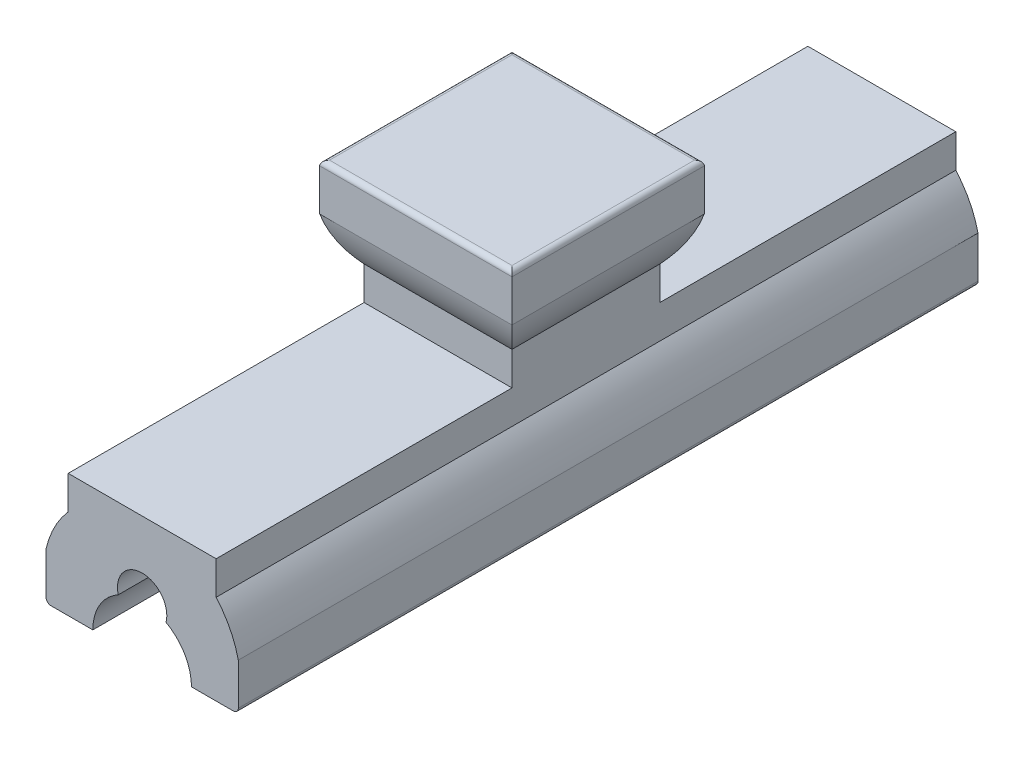
ISO-10303-21;
HEADER;
FILE_DESCRIPTION(('STEP AP214'),'2;1');
FILE_NAME('part.step','',(''),(''),'','','');
FILE_SCHEMA(('AUTOMOTIVE_DESIGN { 1 0 10303 214 1 1 1 1 }'));
ENDSEC;
DATA;
#1=APPLICATION_CONTEXT('core data for automotive mechanical design processes');
#2=APPLICATION_PROTOCOL_DEFINITION('international standard','automotive_design',2000,#1);
#3=PRODUCT_CONTEXT('',#1,'mechanical');
#4=PRODUCT('Part','Part','',(#3));
#5=PRODUCT_RELATED_PRODUCT_CATEGORY('part','',(#4));
#6=PRODUCT_DEFINITION_FORMATION('','',#4);
#7=PRODUCT_DEFINITION_CONTEXT('part definition',#1,'design');
#8=PRODUCT_DEFINITION('design','',#6,#7);
#9=PRODUCT_DEFINITION_SHAPE('','',#8);
#10=(LENGTH_UNIT() NAMED_UNIT(*) SI_UNIT(.MILLI.,.METRE.));
#11=(NAMED_UNIT(*) PLANE_ANGLE_UNIT() SI_UNIT($,.RADIAN.));
#12=(NAMED_UNIT(*) SI_UNIT($,.STERADIAN.) SOLID_ANGLE_UNIT());
#13=UNCERTAINTY_MEASURE_WITH_UNIT(LENGTH_MEASURE(1.E-05),#10,'distance_accuracy_value','');
#14=(GEOMETRIC_REPRESENTATION_CONTEXT(3) GLOBAL_UNCERTAINTY_ASSIGNED_CONTEXT((#13)) GLOBAL_UNIT_ASSIGNED_CONTEXT((#10,
#11,#12)) REPRESENTATION_CONTEXT('',''));
#15=CARTESIAN_POINT('',(0.,0.,0.));
#16=DIRECTION('',(0.,0.,1.));
#17=DIRECTION('',(1.,0.,0.));
#18=AXIS2_PLACEMENT_3D('',#15,#16,#17);
#19=CARTESIAN_POINT('',(0.,2.,-2.));
#20=DIRECTION('',(0.,0.,1.));
#21=DIRECTION('',(1.,0.,0.));
#22=AXIS2_PLACEMENT_3D('',#19,#20,#21);
#23=CYLINDRICAL_SURFACE('',#22,2.);
#24=DIRECTION('',(0.,0.,1.));
#25=VECTOR('',#24,1.);
#26=CARTESIAN_POINT('',(-1.5,0.677124344467706,-2.));
#27=LINE('',#26,#25);
#28=CARTESIAN_POINT('',(-1.5,0.677124344467706,-1.5));
#29=VERTEX_POINT('',#28);
#30=CARTESIAN_POINT('',(-1.5,0.677124344467706,1.5));
#31=VERTEX_POINT('',#30);
#32=EDGE_CURVE('E228',#29,#31,#27,.T.);
#33=ORIENTED_EDGE('',*,*,#32,.T.);
#34=CARTESIAN_POINT('',(0.,2.,0.));
#35=DIRECTION('',(0.707106781186547,0.,0.707106781186547));
#36=DIRECTION('',(0.707106781186547,0.,-0.707106781186547));
#37=AXIS2_PLACEMENT_3D('',#34,#35,#36);
#38=ELLIPSE('',#37,2.82842712474619,2.);
#39=CARTESIAN_POINT('',(-1.95,1.55559027913422,1.95));
#40=VERTEX_POINT('',#39);
#41=EDGE_CURVE('E203',#31,#40,#38,.F.);
#42=ORIENTED_EDGE('',*,*,#41,.T.);
#43=DIRECTION('',(0.,0.,1.));
#44=VECTOR('',#43,1.);
#45=CARTESIAN_POINT('',(-1.95,1.55559027913422,-2.));
#46=LINE('',#45,#44);
#47=CARTESIAN_POINT('',(-1.95,1.55559027913422,-1.95));
#48=VERTEX_POINT('',#47);
#49=EDGE_CURVE('E226',#48,#40,#46,.T.);
#50=ORIENTED_EDGE('',*,*,#49,.F.);
#51=CARTESIAN_POINT('',(0.,2.,0.));
#52=DIRECTION('',(0.707106781186547,0.,-0.707106781186547));
#53=DIRECTION('',(0.707106781186547,0.,0.707106781186547));
#54=AXIS2_PLACEMENT_3D('',#51,#52,#53);
#55=ELLIPSE('',#54,2.82842712474619,2.);
#56=EDGE_CURVE('E332',#48,#29,#55,.F.);
#57=ORIENTED_EDGE('',*,*,#56,.T.);
#58=EDGE_LOOP('',(#33,#42,#50,#57));
#59=FACE_BOUND('',#58,.T.);
#60=ADVANCED_FACE('F36',(#59),#23,.T.);
#61=CARTESIAN_POINT('',(-1.95,-1.90134985467839,-2.));
#62=DIRECTION('',(-1.,0.,0.));
#63=DIRECTION('',(0.,0.,1.));
#64=AXIS2_PLACEMENT_3D('',#61,#62,#63);
#65=PLANE('',#64);
#66=DIRECTION('',(0.,1.,0.));
#67=VECTOR('',#66,1.);
#68=CARTESIAN_POINT('',(-1.95,2.5,1.95));
#69=LINE('',#68,#67);
#70=CARTESIAN_POINT('',(-1.95,2.4,1.95));
#71=VERTEX_POINT('',#70);
#72=EDGE_CURVE('E214',#40,#71,#69,.T.);
#73=ORIENTED_EDGE('',*,*,#72,.T.);
#74=DIRECTION('',(0.,0.,1.));
#75=VECTOR('',#74,1.);
#76=CARTESIAN_POINT('',(-1.95,2.4,-1.95));
#77=LINE('',#76,#75);
#78=CARTESIAN_POINT('',(-1.95,2.4,-1.95));
#79=VERTEX_POINT('',#78);
#80=EDGE_CURVE('E282',#71,#79,#77,.F.);
#81=ORIENTED_EDGE('',*,*,#80,.T.);
#82=DIRECTION('',(0.,-1.,0.));
#83=VECTOR('',#82,1.);
#84=CARTESIAN_POINT('',(-1.95,2.5,-1.95));
#85=LINE('',#84,#83);
#86=EDGE_CURVE('E210',#79,#48,#85,.T.);
#87=ORIENTED_EDGE('',*,*,#86,.T.);
#88=ORIENTED_EDGE('',*,*,#49,.T.);
#89=EDGE_LOOP('',(#73,#81,#87,#88));
#90=FACE_BOUND('',#89,.T.);
#91=ADVANCED_FACE('F231',(#90),#65,.T.);
#92=CARTESIAN_POINT('',(0.,2.5,-2.));
#93=DIRECTION('',(0.,-1.,0.));
#94=DIRECTION('',(0.,0.,-1.));
#95=AXIS2_PLACEMENT_3D('',#92,#93,#94);
#96=PLANE('',#95);
#97=DIRECTION('',(-1.,0.,0.));
#98=VECTOR('',#97,1.);
#99=CARTESIAN_POINT('',(-1.95,2.5,-1.85));
#100=LINE('',#99,#98);
#101=CARTESIAN_POINT('',(1.85,2.5,-1.85));
#102=VERTEX_POINT('',#101);
#103=CARTESIAN_POINT('',(-1.85,2.5,-1.85));
#104=VERTEX_POINT('',#103);
#105=EDGE_CURVE('E277',#102,#104,#100,.T.);
#106=ORIENTED_EDGE('',*,*,#105,.T.);
#107=DIRECTION('',(0.,0.,1.));
#108=VECTOR('',#107,1.);
#109=CARTESIAN_POINT('',(-1.85,2.5,1.95));
#110=LINE('',#109,#108);
#111=CARTESIAN_POINT('',(-1.85,2.5,1.85));
#112=VERTEX_POINT('',#111);
#113=EDGE_CURVE('E279',#104,#112,#110,.T.);
#114=ORIENTED_EDGE('',*,*,#113,.T.);
#115=DIRECTION('',(-1.,0.,0.));
#116=VECTOR('',#115,1.);
#117=CARTESIAN_POINT('',(1.95,2.5,1.85));
#118=LINE('',#117,#116);
#119=CARTESIAN_POINT('',(1.85,2.5,1.85));
#120=VERTEX_POINT('',#119);
#121=EDGE_CURVE('E273',#112,#120,#118,.F.);
#122=ORIENTED_EDGE('',*,*,#121,.T.);
#123=DIRECTION('',(0.,0.,1.));
#124=VECTOR('',#123,1.);
#125=CARTESIAN_POINT('',(1.85,2.5,-2.));
#126=LINE('',#125,#124);
#127=EDGE_CURVE('E275',#120,#102,#126,.F.);
#128=ORIENTED_EDGE('',*,*,#127,.T.);
#129=EDGE_LOOP('',(#106,#114,#122,#128));
#130=FACE_BOUND('',#129,.T.);
#131=ADVANCED_FACE('F530',(#130),#96,.F.);
#132=CARTESIAN_POINT('',(1.95,-1.90134985467839,-2.));
#133=DIRECTION('',(-1.,0.,0.));
#134=DIRECTION('',(0.,0.,1.));
#135=AXIS2_PLACEMENT_3D('',#132,#133,#134);
#136=PLANE('',#135);
#137=DIRECTION('',(0.,1.,0.));
#138=VECTOR('',#137,1.);
#139=CARTESIAN_POINT('',(1.95,2.5,-1.95));
#140=LINE('',#139,#138);
#141=CARTESIAN_POINT('',(1.95,1.55559027913422,-1.95));
#142=VERTEX_POINT('',#141);
#143=CARTESIAN_POINT('',(1.95,2.4,-1.95));
#144=VERTEX_POINT('',#143);
#145=EDGE_CURVE('E327',#142,#144,#140,.T.);
#146=ORIENTED_EDGE('',*,*,#145,.T.);
#147=DIRECTION('',(0.,0.,1.));
#148=VECTOR('',#147,1.);
#149=CARTESIAN_POINT('',(1.95,2.4,-2.));
#150=LINE('',#149,#148);
#151=CARTESIAN_POINT('',(1.95,2.4,1.95));
#152=VERTEX_POINT('',#151);
#153=EDGE_CURVE('E286',#144,#152,#150,.T.);
#154=ORIENTED_EDGE('',*,*,#153,.T.);
#155=DIRECTION('',(0.,-1.,0.));
#156=VECTOR('',#155,1.);
#157=CARTESIAN_POINT('',(1.95,2.5,1.95));
#158=LINE('',#157,#156);
#159=CARTESIAN_POINT('',(1.95,1.55559027913422,1.95));
#160=VERTEX_POINT('',#159);
#161=EDGE_CURVE('E211',#152,#160,#158,.T.);
#162=ORIENTED_EDGE('',*,*,#161,.T.);
#163=DIRECTION('',(0.,0.,1.));
#164=VECTOR('',#163,1.);
#165=CARTESIAN_POINT('',(1.95,1.55559027913422,-2.));
#166=LINE('',#165,#164);
#167=EDGE_CURVE('E234',#142,#160,#166,.T.);
#168=ORIENTED_EDGE('',*,*,#167,.F.);
#169=EDGE_LOOP('',(#146,#154,#162,#168));
#170=FACE_BOUND('',#169,.T.);
#171=ADVANCED_FACE('F324',(#170),#136,.F.);
#172=CARTESIAN_POINT('',(0.,2.,-2.));
#173=DIRECTION('',(0.,0.,1.));
#174=DIRECTION('',(1.,0.,0.));
#175=AXIS2_PLACEMENT_3D('',#172,#173,#174);
#176=CYLINDRICAL_SURFACE('',#175,2.);
#177=ORIENTED_EDGE('',*,*,#167,.T.);
#178=CARTESIAN_POINT('',(0.,2.,0.));
#179=DIRECTION('',(-0.707106781186547,0.,0.707106781186547));
#180=DIRECTION('',(-0.707106781186547,0.,-0.707106781186547));
#181=AXIS2_PLACEMENT_3D('',#178,#179,#180);
#182=ELLIPSE('',#181,2.82842712474619,2.);
#183=CARTESIAN_POINT('',(1.5,0.677124344467706,1.5));
#184=VERTEX_POINT('',#183);
#185=EDGE_CURVE('E206',#184,#160,#182,.T.);
#186=ORIENTED_EDGE('',*,*,#185,.F.);
#187=DIRECTION('',(0.,0.,1.));
#188=VECTOR('',#187,1.);
#189=CARTESIAN_POINT('',(1.5,0.677124344467706,-2.));
#190=LINE('',#189,#188);
#191=CARTESIAN_POINT('',(1.5,0.677124344467706,-1.5));
#192=VERTEX_POINT('',#191);
#193=EDGE_CURVE('E238',#192,#184,#190,.T.);
#194=ORIENTED_EDGE('',*,*,#193,.F.);
#195=CARTESIAN_POINT('',(0.,2.,0.));
#196=DIRECTION('',(-0.707106781186547,0.,-0.707106781186547));
#197=DIRECTION('',(-0.707106781186547,0.,0.707106781186547));
#198=AXIS2_PLACEMENT_3D('',#195,#196,#197);
#199=ELLIPSE('',#198,2.82842712474619,2.);
#200=EDGE_CURVE('E335',#142,#192,#199,.T.);
#201=ORIENTED_EDGE('',*,*,#200,.F.);
#202=EDGE_LOOP('',(#177,#186,#194,#201));
#203=FACE_BOUND('',#202,.T.);
#204=ADVANCED_FACE('F474',(#203),#176,.T.);
#205=CARTESIAN_POINT('',(-1.5,0.,-7.5));
#206=DIRECTION('',(0.,1.,0.));
#207=DIRECTION('',(0.,0.,1.));
#208=AXIS2_PLACEMENT_3D('',#205,#206,#207);
#209=PLANE('',#208);
#210=DIRECTION('',(-1.,0.,0.));
#211=VECTOR('',#210,1.);
#212=CARTESIAN_POINT('',(-1.5,0.,-1.5));
#213=LINE('',#212,#211);
#214=CARTESIAN_POINT('',(1.5,0.,-1.5));
#215=VERTEX_POINT('',#214);
#216=CARTESIAN_POINT('',(-1.5,0.,-1.5));
#217=VERTEX_POINT('',#216);
#218=EDGE_CURVE('E255',#215,#217,#213,.T.);
#219=ORIENTED_EDGE('',*,*,#218,.F.);
#220=DIRECTION('',(0.,0.,1.));
#221=VECTOR('',#220,1.);
#222=CARTESIAN_POINT('',(1.5,0.,-7.5));
#223=LINE('',#222,#221);
#224=CARTESIAN_POINT('',(1.5,0.,-7.5));
#225=VERTEX_POINT('',#224);
#226=EDGE_CURVE('E365',#225,#215,#223,.T.);
#227=ORIENTED_EDGE('',*,*,#226,.F.);
#228=DIRECTION('',(-1.,0.,0.));
#229=VECTOR('',#228,1.);
#230=CARTESIAN_POINT('',(-1.5,0.,-7.5));
#231=LINE('',#230,#229);
#232=CARTESIAN_POINT('',(-1.5,0.,-7.5));
#233=VERTEX_POINT('',#232);
#234=EDGE_CURVE('E398',#225,#233,#231,.T.);
#235=ORIENTED_EDGE('',*,*,#234,.T.);
#236=DIRECTION('',(0.,0.,1.));
#237=VECTOR('',#236,1.);
#238=CARTESIAN_POINT('',(-1.5,0.,-7.5));
#239=LINE('',#238,#237);
#240=EDGE_CURVE('E367',#233,#217,#239,.T.);
#241=ORIENTED_EDGE('',*,*,#240,.T.);
#242=EDGE_LOOP('',(#219,#227,#235,#241));
#243=FACE_BOUND('',#242,.T.);
#244=ADVANCED_FACE('F363',(#243),#209,.T.);
#245=CARTESIAN_POINT('',(-1.5,0.,-7.5));
#246=DIRECTION('',(-1.,0.,0.));
#247=DIRECTION('',(0.,0.,1.));
#248=AXIS2_PLACEMENT_3D('',#245,#246,#247);
#249=PLANE('',#248);
#250=ORIENTED_EDGE('',*,*,#32,.F.);
#251=DIRECTION('',(0.,-1.,0.));
#252=VECTOR('',#251,1.);
#253=CARTESIAN_POINT('',(-1.5,1.,-1.5));
#254=LINE('',#253,#252);
#255=EDGE_CURVE('E347',#29,#217,#254,.T.);
#256=ORIENTED_EDGE('',*,*,#255,.T.);
#257=ORIENTED_EDGE('',*,*,#240,.F.);
#258=DIRECTION('',(0.,-1.,0.));
#259=VECTOR('',#258,1.);
#260=CARTESIAN_POINT('',(-1.5,0.,-7.5));
#261=LINE('',#260,#259);
#262=CARTESIAN_POINT('',(-1.5,-0.677124344467706,-7.5));
#263=VERTEX_POINT('',#262);
#264=EDGE_CURVE('E428',#233,#263,#261,.T.);
#265=ORIENTED_EDGE('',*,*,#264,.T.);
#266=DIRECTION('',(0.,0.,1.));
#267=VECTOR('',#266,1.);
#268=CARTESIAN_POINT('',(-1.5,-0.677124344467706,-7.5));
#269=LINE('',#268,#267);
#270=CARTESIAN_POINT('',(-1.5,-0.677124344467706,7.5));
#271=VERTEX_POINT('',#270);
#272=EDGE_CURVE('E397',#263,#271,#269,.T.);
#273=ORIENTED_EDGE('',*,*,#272,.T.);
#274=DIRECTION('',(0.,-1.,0.));
#275=VECTOR('',#274,1.);
#276=CARTESIAN_POINT('',(-1.5,0.,7.5));
#277=LINE('',#276,#275);
#278=CARTESIAN_POINT('',(-1.5,0.,7.5));
#279=VERTEX_POINT('',#278);
#280=EDGE_CURVE('E272',#279,#271,#277,.T.);
#281=ORIENTED_EDGE('',*,*,#280,.F.);
#282=CARTESIAN_POINT('',(-1.5,0.,1.5));
#283=VERTEX_POINT('',#282);
#284=EDGE_CURVE('E372',#283,#279,#239,.T.);
#285=ORIENTED_EDGE('',*,*,#284,.F.);
#286=DIRECTION('',(0.,-1.,0.));
#287=VECTOR('',#286,1.);
#288=CARTESIAN_POINT('',(-1.5,1.,1.5));
#289=LINE('',#288,#287);
#290=EDGE_CURVE('E267',#31,#283,#289,.T.);
#291=ORIENTED_EDGE('',*,*,#290,.F.);
#292=EDGE_LOOP('',(#250,#256,#257,#265,#273,#281,#285,#291));
#293=FACE_BOUND('',#292,.T.);
#294=ADVANCED_FACE('F346',(#293),#249,.T.);
#295=DIRECTION('',(1.,0.,0.));
#296=VECTOR('',#295,1.);
#297=CARTESIAN_POINT('',(-1.5,0.,1.5));
#298=LINE('',#297,#296);
#299=CARTESIAN_POINT('',(1.5,0.,1.5));
#300=VERTEX_POINT('',#299);
#301=EDGE_CURVE('E246',#283,#300,#298,.T.);
#302=ORIENTED_EDGE('',*,*,#301,.F.);
#303=ORIENTED_EDGE('',*,*,#284,.T.);
#304=DIRECTION('',(-1.,0.,0.));
#305=VECTOR('',#304,1.);
#306=CARTESIAN_POINT('',(-1.5,0.,7.5));
#307=LINE('',#306,#305);
#308=CARTESIAN_POINT('',(1.5,0.,7.5));
#309=VERTEX_POINT('',#308);
#310=EDGE_CURVE('E430',#309,#279,#307,.T.);
#311=ORIENTED_EDGE('',*,*,#310,.F.);
#312=EDGE_CURVE('E256',#300,#309,#223,.T.);
#313=ORIENTED_EDGE('',*,*,#312,.F.);
#314=EDGE_LOOP('',(#302,#303,#311,#313));
#315=FACE_BOUND('',#314,.T.);
#316=ADVANCED_FACE('F467',(#315),#209,.T.);
#317=CARTESIAN_POINT('',(1.5,0.,-7.5));
#318=DIRECTION('',(1.,0.,0.));
#319=DIRECTION('',(0.,0.,-1.));
#320=AXIS2_PLACEMENT_3D('',#317,#318,#319);
#321=PLANE('',#320);
#322=ORIENTED_EDGE('',*,*,#193,.T.);
#323=DIRECTION('',(0.,-1.,0.));
#324=VECTOR('',#323,1.);
#325=CARTESIAN_POINT('',(1.5,1.,1.5));
#326=LINE('',#325,#324);
#327=EDGE_CURVE('E264',#184,#300,#326,.T.);
#328=ORIENTED_EDGE('',*,*,#327,.T.);
#329=ORIENTED_EDGE('',*,*,#312,.T.);
#330=DIRECTION('',(0.,1.,0.));
#331=VECTOR('',#330,1.);
#332=CARTESIAN_POINT('',(1.5,0.,7.5));
#333=LINE('',#332,#331);
#334=CARTESIAN_POINT('',(1.5,-0.677124344467706,7.5));
#335=VERTEX_POINT('',#334);
#336=EDGE_CURVE('E433',#335,#309,#333,.T.);
#337=ORIENTED_EDGE('',*,*,#336,.F.);
#338=DIRECTION('',(0.,0.,1.));
#339=VECTOR('',#338,1.);
#340=CARTESIAN_POINT('',(1.5,-0.677124344467706,-7.5));
#341=LINE('',#340,#339);
#342=CARTESIAN_POINT('',(1.5,-0.677124344467706,-7.5));
#343=VERTEX_POINT('',#342);
#344=EDGE_CURVE('E374',#343,#335,#341,.T.);
#345=ORIENTED_EDGE('',*,*,#344,.F.);
#346=DIRECTION('',(0.,1.,0.));
#347=VECTOR('',#346,1.);
#348=CARTESIAN_POINT('',(1.5,0.,-7.5));
#349=LINE('',#348,#347);
#350=EDGE_CURVE('E370',#343,#225,#349,.T.);
#351=ORIENTED_EDGE('',*,*,#350,.T.);
#352=ORIENTED_EDGE('',*,*,#226,.T.);
#353=DIRECTION('',(0.,-1.,0.));
#354=VECTOR('',#353,1.);
#355=CARTESIAN_POINT('',(1.5,1.,-1.5));
#356=LINE('',#355,#354);
#357=EDGE_CURVE('E268',#192,#215,#356,.T.);
#358=ORIENTED_EDGE('',*,*,#357,.F.);
#359=EDGE_LOOP('',(#322,#328,#329,#337,#345,#351,#352,#358));
#360=FACE_BOUND('',#359,.T.);
#361=ADVANCED_FACE('F368',(#360),#321,.T.);
#362=CARTESIAN_POINT('',(0.,-2.,-7.5));
#363=DIRECTION('',(0.,0.,1.));
#364=DIRECTION('',(1.,0.,0.));
#365=AXIS2_PLACEMENT_3D('',#362,#363,#364);
#366=CYLINDRICAL_SURFACE('',#365,2.);
#367=ORIENTED_EDGE('',*,*,#344,.T.);
#368=CARTESIAN_POINT('',(0.,-2.,7.5));
#369=DIRECTION('',(0.,0.,1.));
#370=DIRECTION('',(1.,0.,0.));
#371=AXIS2_PLACEMENT_3D('',#368,#369,#370);
#372=CIRCLE('',#371,2.);
#373=CARTESIAN_POINT('',(1.95,-1.55559027913422,7.5));
#374=VERTEX_POINT('',#373);
#375=EDGE_CURVE('E436',#374,#335,#372,.T.);
#376=ORIENTED_EDGE('',*,*,#375,.F.);
#377=DIRECTION('',(0.,0.,1.));
#378=VECTOR('',#377,1.);
#379=CARTESIAN_POINT('',(1.95,-1.55559027913422,-7.5));
#380=LINE('',#379,#378);
#381=CARTESIAN_POINT('',(1.95,-1.55559027913422,-7.5));
#382=VERTEX_POINT('',#381);
#383=EDGE_CURVE('E383',#382,#374,#380,.T.);
#384=ORIENTED_EDGE('',*,*,#383,.F.);
#385=CARTESIAN_POINT('',(0.,-2.,-7.5));
#386=DIRECTION('',(0.,0.,1.));
#387=DIRECTION('',(1.,0.,0.));
#388=AXIS2_PLACEMENT_3D('',#385,#386,#387);
#389=CIRCLE('',#388,2.);
#390=EDGE_CURVE('E402',#382,#343,#389,.T.);
#391=ORIENTED_EDGE('',*,*,#390,.T.);
#392=EDGE_LOOP('',(#367,#376,#384,#391));
#393=FACE_BOUND('',#392,.T.);
#394=ADVANCED_FACE('F479',(#393),#366,.T.);
#395=CARTESIAN_POINT('',(1.95,-2.5,-7.5));
#396=DIRECTION('',(1.,0.,0.));
#397=DIRECTION('',(0.,1.,0.));
#398=AXIS2_PLACEMENT_3D('',#395,#396,#397);
#399=PLANE('',#398);
#400=DIRECTION('',(0.,1.,0.));
#401=VECTOR('',#400,1.);
#402=CARTESIAN_POINT('',(1.95,-2.5,7.5));
#403=LINE('',#402,#401);
#404=CARTESIAN_POINT('',(1.95,-2.4,7.5));
#405=VERTEX_POINT('',#404);
#406=EDGE_CURVE('E439',#405,#374,#403,.T.);
#407=ORIENTED_EDGE('',*,*,#406,.F.);
#408=DIRECTION('',(0.,0.,1.));
#409=VECTOR('',#408,1.);
#410=CARTESIAN_POINT('',(1.95,-2.4,-7.5));
#411=LINE('',#410,#409);
#412=CARTESIAN_POINT('',(1.95,-2.4,-7.5));
#413=VERTEX_POINT('',#412);
#414=EDGE_CURVE('E11',#405,#413,#411,.F.);
#415=ORIENTED_EDGE('',*,*,#414,.T.);
#416=DIRECTION('',(0.,1.,0.));
#417=VECTOR('',#416,1.);
#418=CARTESIAN_POINT('',(1.95,-2.5,-7.5));
#419=LINE('',#418,#417);
#420=EDGE_CURVE('E407',#413,#382,#419,.T.);
#421=ORIENTED_EDGE('',*,*,#420,.T.);
#422=ORIENTED_EDGE('',*,*,#383,.T.);
#423=EDGE_LOOP('',(#407,#415,#421,#422));
#424=FACE_BOUND('',#423,.T.);
#425=ADVANCED_FACE('F516',(#424),#399,.T.);
#426=CARTESIAN_POINT('',(1.,-2.5,-7.5));
#427=DIRECTION('',(0.,-1.,0.));
#428=DIRECTION('',(0.,0.,-1.));
#429=AXIS2_PLACEMENT_3D('',#426,#427,#428);
#430=PLANE('',#429);
#431=DIRECTION('',(1.,0.,0.));
#432=VECTOR('',#431,1.);
#433=CARTESIAN_POINT('',(1.,-2.5,-7.5));
#434=LINE('',#433,#432);
#435=CARTESIAN_POINT('',(1.,-2.5,-7.5));
#436=VERTEX_POINT('',#435);
#437=CARTESIAN_POINT('',(1.85,-2.5,-7.5));
#438=VERTEX_POINT('',#437);
#439=EDGE_CURVE('E409',#436,#438,#434,.T.);
#440=ORIENTED_EDGE('',*,*,#439,.T.);
#441=DIRECTION('',(0.,0.,1.));
#442=VECTOR('',#441,1.);
#443=CARTESIAN_POINT('',(1.85,-2.5,-7.5));
#444=LINE('',#443,#442);
#445=CARTESIAN_POINT('',(1.85,-2.5,7.5));
#446=VERTEX_POINT('',#445);
#447=EDGE_CURVE('E45',#438,#446,#444,.T.);
#448=ORIENTED_EDGE('',*,*,#447,.T.);
#449=DIRECTION('',(1.,0.,0.));
#450=VECTOR('',#449,1.);
#451=CARTESIAN_POINT('',(1.,-2.5,7.5));
#452=LINE('',#451,#450);
#453=CARTESIAN_POINT('',(1.,-2.5,7.5));
#454=VERTEX_POINT('',#453);
#455=EDGE_CURVE('E441',#454,#446,#452,.T.);
#456=ORIENTED_EDGE('',*,*,#455,.F.);
#457=DIRECTION('',(0.,0.,1.));
#458=VECTOR('',#457,1.);
#459=CARTESIAN_POINT('',(1.,-2.5,-7.5));
#460=LINE('',#459,#458);
#461=EDGE_CURVE('E386',#436,#454,#460,.T.);
#462=ORIENTED_EDGE('',*,*,#461,.F.);
#463=EDGE_LOOP('',(#440,#448,#456,#462));
#464=FACE_BOUND('',#463,.T.);
#465=ADVANCED_FACE('F513',(#464),#430,.T.);
#466=CARTESIAN_POINT('',(0.,-2.5,-7.5));
#467=DIRECTION('',(0.,0.,1.));
#468=DIRECTION('',(1.,0.,0.));
#469=AXIS2_PLACEMENT_3D('',#466,#467,#468);
#470=CYLINDRICAL_SURFACE('',#469,1.);
#471=ORIENTED_EDGE('',*,*,#461,.T.);
#472=CARTESIAN_POINT('',(0.,-2.5,7.5));
#473=DIRECTION('',(0.,0.,-1.));
#474=DIRECTION('',(1.,0.,0.));
#475=AXIS2_PLACEMENT_3D('',#472,#473,#474);
#476=CIRCLE('',#475,1.);
#477=CARTESIAN_POINT('',(0.484122918275927,-1.625,7.5));
#478=VERTEX_POINT('',#477);
#479=EDGE_CURVE('E444',#478,#454,#476,.T.);
#480=ORIENTED_EDGE('',*,*,#479,.F.);
#481=DIRECTION('',(0.,0.,1.));
#482=VECTOR('',#481,1.);
#483=CARTESIAN_POINT('',(0.484122918275927,-1.625,-7.5));
#484=LINE('',#483,#482);
#485=CARTESIAN_POINT('',(0.484122918275927,-1.625,-7.5));
#486=VERTEX_POINT('',#485);
#487=EDGE_CURVE('E388',#486,#478,#484,.T.);
#488=ORIENTED_EDGE('',*,*,#487,.F.);
#489=CARTESIAN_POINT('',(0.,-2.5,-7.5));
#490=DIRECTION('',(0.,0.,-1.));
#491=DIRECTION('',(1.,0.,0.));
#492=AXIS2_PLACEMENT_3D('',#489,#490,#491);
#493=CIRCLE('',#492,1.);
#494=EDGE_CURVE('E411',#486,#436,#493,.T.);
#495=ORIENTED_EDGE('',*,*,#494,.T.);
#496=EDGE_LOOP('',(#471,#480,#488,#495));
#497=FACE_BOUND('',#496,.T.);
#498=ADVANCED_FACE('F510',(#497),#470,.F.);
#499=CARTESIAN_POINT('',(0.,-1.5,-7.5));
#500=DIRECTION('',(0.,0.,1.));
#501=DIRECTION('',(1.,0.,0.));
#502=AXIS2_PLACEMENT_3D('',#499,#500,#501);
#503=CYLINDRICAL_SURFACE('',#502,0.5);
#504=ORIENTED_EDGE('',*,*,#487,.T.);
#505=CARTESIAN_POINT('',(0.,-1.5,7.5));
#506=DIRECTION('',(0.,0.,-1.));
#507=DIRECTION('',(1.,0.,0.));
#508=AXIS2_PLACEMENT_3D('',#505,#506,#507);
#509=CIRCLE('',#508,0.5);
#510=CARTESIAN_POINT('',(-0.484122918275928,-1.625,7.5));
#511=VERTEX_POINT('',#510);
#512=EDGE_CURVE('E447',#511,#478,#509,.T.);
#513=ORIENTED_EDGE('',*,*,#512,.F.);
#514=DIRECTION('',(0.,0.,1.));
#515=VECTOR('',#514,1.);
#516=CARTESIAN_POINT('',(-0.484122918275928,-1.625,-7.5));
#517=LINE('',#516,#515);
#518=CARTESIAN_POINT('',(-0.484122918275928,-1.625,-7.5));
#519=VERTEX_POINT('',#518);
#520=EDGE_CURVE('E390',#519,#511,#517,.T.);
#521=ORIENTED_EDGE('',*,*,#520,.F.);
#522=CARTESIAN_POINT('',(0.,-1.5,-7.5));
#523=DIRECTION('',(0.,0.,-1.));
#524=DIRECTION('',(1.,0.,0.));
#525=AXIS2_PLACEMENT_3D('',#522,#523,#524);
#526=CIRCLE('',#525,0.5);
#527=EDGE_CURVE('E414',#519,#486,#526,.T.);
#528=ORIENTED_EDGE('',*,*,#527,.T.);
#529=EDGE_LOOP('',(#504,#513,#521,#528));
#530=FACE_BOUND('',#529,.T.);
#531=ADVANCED_FACE('F507',(#530),#503,.F.);
#532=CARTESIAN_POINT('',(0.,-2.5,-7.5));
#533=DIRECTION('',(0.,0.,1.));
#534=DIRECTION('',(1.,0.,0.));
#535=AXIS2_PLACEMENT_3D('',#532,#533,#534);
#536=CYLINDRICAL_SURFACE('',#535,1.);
#537=ORIENTED_EDGE('',*,*,#520,.T.);
#538=CARTESIAN_POINT('',(0.,-2.5,7.5));
#539=DIRECTION('',(0.,0.,-1.));
#540=DIRECTION('',(1.,0.,0.));
#541=AXIS2_PLACEMENT_3D('',#538,#539,#540);
#542=CIRCLE('',#541,1.);
#543=CARTESIAN_POINT('',(-1.,-2.5,7.5));
#544=VERTEX_POINT('',#543);
#545=EDGE_CURVE('E450',#544,#511,#542,.T.);
#546=ORIENTED_EDGE('',*,*,#545,.F.);
#547=DIRECTION('',(0.,0.,1.));
#548=VECTOR('',#547,1.);
#549=CARTESIAN_POINT('',(-1.,-2.5,-7.5));
#550=LINE('',#549,#548);
#551=CARTESIAN_POINT('',(-1.,-2.5,-7.5));
#552=VERTEX_POINT('',#551);
#553=EDGE_CURVE('E392',#552,#544,#550,.T.);
#554=ORIENTED_EDGE('',*,*,#553,.F.);
#555=CARTESIAN_POINT('',(0.,-2.5,-7.5));
#556=DIRECTION('',(0.,0.,-1.));
#557=DIRECTION('',(1.,0.,0.));
#558=AXIS2_PLACEMENT_3D('',#555,#556,#557);
#559=CIRCLE('',#558,1.);
#560=EDGE_CURVE('E417',#552,#519,#559,.T.);
#561=ORIENTED_EDGE('',*,*,#560,.T.);
#562=EDGE_LOOP('',(#537,#546,#554,#561));
#563=FACE_BOUND('',#562,.T.);
#564=ADVANCED_FACE('F503',(#563),#536,.F.);
#565=CARTESIAN_POINT('',(-1.95,-2.5,-7.5));
#566=DIRECTION('',(0.,-1.,0.));
#567=DIRECTION('',(1.,0.,0.));
#568=AXIS2_PLACEMENT_3D('',#565,#566,#567);
#569=PLANE('',#568);
#570=DIRECTION('',(1.,0.,0.));
#571=VECTOR('',#570,1.);
#572=CARTESIAN_POINT('',(-1.95,-2.5,7.5));
#573=LINE('',#572,#571);
#574=CARTESIAN_POINT('',(-1.85,-2.5,7.5));
#575=VERTEX_POINT('',#574);
#576=EDGE_CURVE('E453',#575,#544,#573,.T.);
#577=ORIENTED_EDGE('',*,*,#576,.F.);
#578=DIRECTION('',(0.,0.,1.));
#579=VECTOR('',#578,1.);
#580=CARTESIAN_POINT('',(-1.85,-2.5,-7.5));
#581=LINE('',#580,#579);
#582=CARTESIAN_POINT('',(-1.85,-2.5,-7.5));
#583=VERTEX_POINT('',#582);
#584=EDGE_CURVE('E296',#575,#583,#581,.F.);
#585=ORIENTED_EDGE('',*,*,#584,.T.);
#586=DIRECTION('',(1.,0.,0.));
#587=VECTOR('',#586,1.);
#588=CARTESIAN_POINT('',(-1.95,-2.5,-7.5));
#589=LINE('',#588,#587);
#590=EDGE_CURVE('E420',#583,#552,#589,.T.);
#591=ORIENTED_EDGE('',*,*,#590,.T.);
#592=ORIENTED_EDGE('',*,*,#553,.T.);
#593=EDGE_LOOP('',(#577,#585,#591,#592));
#594=FACE_BOUND('',#593,.T.);
#595=ADVANCED_FACE('F495',(#594),#569,.T.);
#596=CARTESIAN_POINT('',(-1.95,-2.5,-7.5));
#597=DIRECTION('',(-1.,0.,0.));
#598=DIRECTION('',(0.,0.,1.));
#599=AXIS2_PLACEMENT_3D('',#596,#597,#598);
#600=PLANE('',#599);
#601=DIRECTION('',(0.,-1.,0.));
#602=VECTOR('',#601,1.);
#603=CARTESIAN_POINT('',(-1.95,-2.5,-7.5));
#604=LINE('',#603,#602);
#605=CARTESIAN_POINT('',(-1.95,-1.55559027913422,-7.5));
#606=VERTEX_POINT('',#605);
#607=CARTESIAN_POINT('',(-1.95,-2.4,-7.5));
#608=VERTEX_POINT('',#607);
#609=EDGE_CURVE('E422',#606,#608,#604,.T.);
#610=ORIENTED_EDGE('',*,*,#609,.T.);
#611=DIRECTION('',(0.,0.,1.));
#612=VECTOR('',#611,1.);
#613=CARTESIAN_POINT('',(-1.95,-2.4,-7.5));
#614=LINE('',#613,#612);
#615=CARTESIAN_POINT('',(-1.95,-2.4,7.5));
#616=VERTEX_POINT('',#615);
#617=EDGE_CURVE('E289',#608,#616,#614,.T.);
#618=ORIENTED_EDGE('',*,*,#617,.T.);
#619=DIRECTION('',(0.,-1.,0.));
#620=VECTOR('',#619,1.);
#621=CARTESIAN_POINT('',(-1.95,-2.5,7.5));
#622=LINE('',#621,#620);
#623=CARTESIAN_POINT('',(-1.95,-1.55559027913422,7.5));
#624=VERTEX_POINT('',#623);
#625=EDGE_CURVE('E455',#624,#616,#622,.T.);
#626=ORIENTED_EDGE('',*,*,#625,.F.);
#627=DIRECTION('',(0.,0.,1.));
#628=VECTOR('',#627,1.);
#629=CARTESIAN_POINT('',(-1.95,-1.55559027913422,-7.5));
#630=LINE('',#629,#628);
#631=EDGE_CURVE('E395',#606,#624,#630,.T.);
#632=ORIENTED_EDGE('',*,*,#631,.F.);
#633=EDGE_LOOP('',(#610,#618,#626,#632));
#634=FACE_BOUND('',#633,.T.);
#635=ADVANCED_FACE('F489',(#634),#600,.T.);
#636=CARTESIAN_POINT('',(0.,-2.,-7.5));
#637=DIRECTION('',(0.,0.,1.));
#638=DIRECTION('',(1.,0.,0.));
#639=AXIS2_PLACEMENT_3D('',#636,#637,#638);
#640=CYLINDRICAL_SURFACE('',#639,2.);
#641=ORIENTED_EDGE('',*,*,#631,.T.);
#642=CARTESIAN_POINT('',(0.,-2.,7.5));
#643=DIRECTION('',(0.,0.,1.));
#644=DIRECTION('',(1.,0.,0.));
#645=AXIS2_PLACEMENT_3D('',#642,#643,#644);
#646=CIRCLE('',#645,2.);
#647=EDGE_CURVE('E458',#271,#624,#646,.T.);
#648=ORIENTED_EDGE('',*,*,#647,.F.);
#649=ORIENTED_EDGE('',*,*,#272,.F.);
#650=CARTESIAN_POINT('',(0.,-2.,-7.5));
#651=DIRECTION('',(0.,0.,1.));
#652=DIRECTION('',(1.,0.,0.));
#653=AXIS2_PLACEMENT_3D('',#650,#651,#652);
#654=CIRCLE('',#653,2.);
#655=EDGE_CURVE('E425',#263,#606,#654,.T.);
#656=ORIENTED_EDGE('',*,*,#655,.T.);
#657=EDGE_LOOP('',(#641,#648,#649,#656));
#658=FACE_BOUND('',#657,.T.);
#659=ADVANCED_FACE('F487',(#658),#640,.T.);
#660=CARTESIAN_POINT('',(0.,-2.,-7.5));
#661=DIRECTION('',(0.,0.,1.));
#662=DIRECTION('',(1.,0.,0.));
#663=AXIS2_PLACEMENT_3D('',#660,#661,#662);
#664=PLANE('',#663);
#665=ORIENTED_EDGE('',*,*,#590,.F.);
#666=CARTESIAN_POINT('',(-1.85,-2.4,-7.5));
#667=DIRECTION('',(0.,0.,1.));
#668=DIRECTION('',(1.,0.,0.));
#669=AXIS2_PLACEMENT_3D('',#666,#667,#668);
#670=CIRCLE('',#669,0.1);
#671=EDGE_CURVE('E299',#583,#608,#670,.F.);
#672=ORIENTED_EDGE('',*,*,#671,.T.);
#673=ORIENTED_EDGE('',*,*,#609,.F.);
#674=ORIENTED_EDGE('',*,*,#655,.F.);
#675=ORIENTED_EDGE('',*,*,#264,.F.);
#676=ORIENTED_EDGE('',*,*,#234,.F.);
#677=ORIENTED_EDGE('',*,*,#350,.F.);
#678=ORIENTED_EDGE('',*,*,#390,.F.);
#679=ORIENTED_EDGE('',*,*,#420,.F.);
#680=CARTESIAN_POINT('',(1.85,-2.4,-7.5));
#681=DIRECTION('',(0.,0.,1.));
#682=DIRECTION('',(1.,0.,0.));
#683=AXIS2_PLACEMENT_3D('',#680,#681,#682);
#684=CIRCLE('',#683,0.1);
#685=EDGE_CURVE('E53',#413,#438,#684,.F.);
#686=ORIENTED_EDGE('',*,*,#685,.T.);
#687=ORIENTED_EDGE('',*,*,#439,.F.);
#688=ORIENTED_EDGE('',*,*,#494,.F.);
#689=ORIENTED_EDGE('',*,*,#527,.F.);
#690=ORIENTED_EDGE('',*,*,#560,.F.);
#691=EDGE_LOOP('',(#665,#672,#673,#674,#675,#676,#677,#678,#679,#686,#687,#688,#689,#690));
#692=FACE_BOUND('',#691,.T.);
#693=ADVANCED_FACE('F482',(#692),#664,.F.);
#694=CARTESIAN_POINT('',(0.,-2.,7.5));
#695=DIRECTION('',(0.,0.,1.));
#696=DIRECTION('',(1.,0.,0.));
#697=AXIS2_PLACEMENT_3D('',#694,#695,#696);
#698=PLANE('',#697);
#699=ORIENTED_EDGE('',*,*,#625,.T.);
#700=CARTESIAN_POINT('',(-1.85,-2.4,7.5));
#701=DIRECTION('',(0.,0.,1.));
#702=DIRECTION('',(1.,0.,0.));
#703=AXIS2_PLACEMENT_3D('',#700,#701,#702);
#704=CIRCLE('',#703,0.1);
#705=EDGE_CURVE('E294',#616,#575,#704,.T.);
#706=ORIENTED_EDGE('',*,*,#705,.T.);
#707=ORIENTED_EDGE('',*,*,#576,.T.);
#708=ORIENTED_EDGE('',*,*,#545,.T.);
#709=ORIENTED_EDGE('',*,*,#512,.T.);
#710=ORIENTED_EDGE('',*,*,#479,.T.);
#711=ORIENTED_EDGE('',*,*,#455,.T.);
#712=CARTESIAN_POINT('',(1.85,-2.4,7.5));
#713=DIRECTION('',(0.,0.,1.));
#714=DIRECTION('',(1.,0.,0.));
#715=AXIS2_PLACEMENT_3D('',#712,#713,#714);
#716=CIRCLE('',#715,0.1);
#717=EDGE_CURVE('E292',#446,#405,#716,.T.);
#718=ORIENTED_EDGE('',*,*,#717,.T.);
#719=ORIENTED_EDGE('',*,*,#406,.T.);
#720=ORIENTED_EDGE('',*,*,#375,.T.);
#721=ORIENTED_EDGE('',*,*,#336,.T.);
#722=ORIENTED_EDGE('',*,*,#310,.T.);
#723=ORIENTED_EDGE('',*,*,#280,.T.);
#724=ORIENTED_EDGE('',*,*,#647,.T.);
#725=EDGE_LOOP('',(#699,#706,#707,#708,#709,#710,#711,#718,#719,#720,#721,#722,#723,#724));
#726=FACE_BOUND('',#725,.T.);
#727=ADVANCED_FACE('F462',(#726),#698,.T.);
#728=CARTESIAN_POINT('',(-1.5,1.,1.5));
#729=DIRECTION('',(0.,0.,-1.));
#730=DIRECTION('',(-1.,0.,0.));
#731=AXIS2_PLACEMENT_3D('',#728,#729,#730);
#732=PLANE('',#731);
#733=ORIENTED_EDGE('',*,*,#327,.F.);
#734=DIRECTION('',(-1.,0.,0.));
#735=VECTOR('',#734,1.);
#736=CARTESIAN_POINT('',(-1.5,0.677124344467706,1.5));
#737=LINE('',#736,#735);
#738=EDGE_CURVE('E236',#184,#31,#737,.T.);
#739=ORIENTED_EDGE('',*,*,#738,.T.);
#740=ORIENTED_EDGE('',*,*,#290,.T.);
#741=ORIENTED_EDGE('',*,*,#301,.T.);
#742=EDGE_LOOP('',(#733,#739,#740,#741));
#743=FACE_BOUND('',#742,.T.);
#744=ADVANCED_FACE('F471',(#743),#732,.F.);
#745=CARTESIAN_POINT('',(-1.5,1.,-1.5));
#746=DIRECTION('',(0.,0.,1.));
#747=DIRECTION('',(1.,0.,0.));
#748=AXIS2_PLACEMENT_3D('',#745,#746,#747);
#749=PLANE('',#748);
#750=ORIENTED_EDGE('',*,*,#255,.F.);
#751=DIRECTION('',(1.,0.,0.));
#752=VECTOR('',#751,1.);
#753=CARTESIAN_POINT('',(-1.5,0.677124344467706,-1.5));
#754=LINE('',#753,#752);
#755=EDGE_CURVE('E269',#29,#192,#754,.T.);
#756=ORIENTED_EDGE('',*,*,#755,.T.);
#757=ORIENTED_EDGE('',*,*,#357,.T.);
#758=ORIENTED_EDGE('',*,*,#218,.T.);
#759=EDGE_LOOP('',(#750,#756,#757,#758));
#760=FACE_BOUND('',#759,.T.);
#761=ADVANCED_FACE('F352',(#760),#749,.F.);
#762=CARTESIAN_POINT('',(1.951,2.5,-1.95));
#763=DIRECTION('',(0.,0.,-1.));
#764=DIRECTION('',(-1.,0.,0.));
#765=AXIS2_PLACEMENT_3D('',#762,#763,#764);
#766=PLANE('',#765);
#767=ORIENTED_EDGE('',*,*,#86,.F.);
#768=DIRECTION('',(-1.,0.,0.));
#769=VECTOR('',#768,1.);
#770=CARTESIAN_POINT('',(1.95,2.4,-1.95));
#771=LINE('',#770,#769);
#772=EDGE_CURVE('E284',#79,#144,#771,.F.);
#773=ORIENTED_EDGE('',*,*,#772,.T.);
#774=ORIENTED_EDGE('',*,*,#145,.F.);
#775=DIRECTION('',(-1.,0.,0.));
#776=VECTOR('',#775,1.);
#777=CARTESIAN_POINT('',(1.951,1.55559027913422,-1.95));
#778=LINE('',#777,#776);
#779=EDGE_CURVE('E244',#142,#48,#778,.T.);
#780=ORIENTED_EDGE('',*,*,#779,.T.);
#781=EDGE_LOOP('',(#767,#773,#774,#780));
#782=FACE_BOUND('',#781,.T.);
#783=ADVANCED_FACE('F338',(#782),#766,.T.);
#784=CARTESIAN_POINT('',(1.951,2.,0.));
#785=DIRECTION('',(-1.,0.,0.));
#786=DIRECTION('',(0.,0.,1.));
#787=AXIS2_PLACEMENT_3D('',#784,#785,#786);
#788=CYLINDRICAL_SURFACE('',#787,2.);
#789=ORIENTED_EDGE('',*,*,#200,.T.);
#790=ORIENTED_EDGE('',*,*,#755,.F.);
#791=ORIENTED_EDGE('',*,*,#56,.F.);
#792=ORIENTED_EDGE('',*,*,#779,.F.);
#793=EDGE_LOOP('',(#789,#790,#791,#792));
#794=FACE_BOUND('',#793,.T.);
#795=ADVANCED_FACE('F341',(#794),#788,.T.);
#796=CARTESIAN_POINT('',(1.951,2.5,1.95));
#797=DIRECTION('',(0.,0.,1.));
#798=DIRECTION('',(0.,-1.,0.));
#799=AXIS2_PLACEMENT_3D('',#796,#797,#798);
#800=PLANE('',#799);
#801=ORIENTED_EDGE('',*,*,#161,.F.);
#802=DIRECTION('',(-1.,0.,0.));
#803=VECTOR('',#802,1.);
#804=CARTESIAN_POINT('',(-1.95,2.4,1.95));
#805=LINE('',#804,#803);
#806=EDGE_CURVE('E217',#152,#71,#805,.T.);
#807=ORIENTED_EDGE('',*,*,#806,.T.);
#808=ORIENTED_EDGE('',*,*,#72,.F.);
#809=DIRECTION('',(-1.,0.,0.));
#810=VECTOR('',#809,1.);
#811=CARTESIAN_POINT('',(1.951,1.55559027913422,1.95));
#812=LINE('',#811,#810);
#813=EDGE_CURVE('E199',#160,#40,#812,.T.);
#814=ORIENTED_EDGE('',*,*,#813,.F.);
#815=EDGE_LOOP('',(#801,#807,#808,#814));
#816=FACE_BOUND('',#815,.T.);
#817=ADVANCED_FACE('F215',(#816),#800,.T.);
#818=CARTESIAN_POINT('',(1.951,2.,0.));
#819=DIRECTION('',(-1.,0.,0.));
#820=DIRECTION('',(0.,0.,1.));
#821=AXIS2_PLACEMENT_3D('',#818,#819,#820);
#822=CYLINDRICAL_SURFACE('',#821,2.);
#823=ORIENTED_EDGE('',*,*,#185,.T.);
#824=ORIENTED_EDGE('',*,*,#813,.T.);
#825=ORIENTED_EDGE('',*,*,#41,.F.);
#826=ORIENTED_EDGE('',*,*,#738,.F.);
#827=EDGE_LOOP('',(#823,#824,#825,#826));
#828=FACE_BOUND('',#827,.T.);
#829=ADVANCED_FACE('F201',(#828),#822,.T.);
#830=CARTESIAN_POINT('',(1.85,2.4,-2.));
#831=DIRECTION('',(0.,0.,1.));
#832=DIRECTION('',(1.,0.,0.));
#833=AXIS2_PLACEMENT_3D('',#830,#831,#832);
#834=CYLINDRICAL_SURFACE('',#833,0.1);
#835=CARTESIAN_POINT('',(1.85,2.4,1.85));
#836=DIRECTION('',(0.707106781186547,0.,-0.707106781186547));
#837=DIRECTION('',(0.707106781186547,0.,0.707106781186547));
#838=AXIS2_PLACEMENT_3D('',#835,#836,#837);
#839=ELLIPSE('',#838,0.14142135623731,0.1);
#840=EDGE_CURVE('E306',#152,#120,#839,.F.);
#841=ORIENTED_EDGE('',*,*,#840,.F.);
#842=ORIENTED_EDGE('',*,*,#153,.F.);
#843=CARTESIAN_POINT('',(1.85,2.4,-1.85));
#844=DIRECTION('',(0.707106781186547,0.,0.707106781186547));
#845=DIRECTION('',(-0.707106781186547,0.,0.707106781186547));
#846=AXIS2_PLACEMENT_3D('',#843,#844,#845);
#847=ELLIPSE('',#846,0.14142135623731,0.1);
#848=EDGE_CURVE('E40',#102,#144,#847,.F.);
#849=ORIENTED_EDGE('',*,*,#848,.F.);
#850=ORIENTED_EDGE('',*,*,#127,.F.);
#851=EDGE_LOOP('',(#841,#842,#849,#850));
#852=FACE_BOUND('',#851,.T.);
#853=ADVANCED_FACE('F321',(#852),#834,.T.);
#854=CARTESIAN_POINT('',(0.,2.4,-1.85));
#855=DIRECTION('',(1.,0.,0.));
#856=DIRECTION('',(0.,0.,-1.));
#857=AXIS2_PLACEMENT_3D('',#854,#855,#856);
#858=CYLINDRICAL_SURFACE('',#857,0.1);
#859=ORIENTED_EDGE('',*,*,#848,.T.);
#860=ORIENTED_EDGE('',*,*,#772,.F.);
#861=CARTESIAN_POINT('',(-1.85,2.4,-1.85));
#862=DIRECTION('',(0.707106781186547,0.,-0.707106781186547));
#863=DIRECTION('',(0.707106781186547,0.,0.707106781186547));
#864=AXIS2_PLACEMENT_3D('',#861,#862,#863);
#865=ELLIPSE('',#864,0.14142135623731,0.1);
#866=EDGE_CURVE('E305',#104,#79,#865,.F.);
#867=ORIENTED_EDGE('',*,*,#866,.F.);
#868=ORIENTED_EDGE('',*,*,#105,.F.);
#869=EDGE_LOOP('',(#859,#860,#867,#868));
#870=FACE_BOUND('',#869,.T.);
#871=ADVANCED_FACE('F316',(#870),#858,.T.);
#872=CARTESIAN_POINT('',(1.951,2.4,1.85));
#873=DIRECTION('',(1.,0.,0.));
#874=DIRECTION('',(0.,0.,-1.));
#875=AXIS2_PLACEMENT_3D('',#872,#873,#874);
#876=CYLINDRICAL_SURFACE('',#875,0.1);
#877=ORIENTED_EDGE('',*,*,#840,.T.);
#878=ORIENTED_EDGE('',*,*,#121,.F.);
#879=CARTESIAN_POINT('',(-1.85,2.4,1.85));
#880=DIRECTION('',(0.707106781186547,0.,0.707106781186547));
#881=DIRECTION('',(0.707106781186547,0.,-0.707106781186547));
#882=AXIS2_PLACEMENT_3D('',#879,#880,#881);
#883=ELLIPSE('',#882,0.14142135623731,0.1);
#884=EDGE_CURVE('E303',#71,#112,#883,.F.);
#885=ORIENTED_EDGE('',*,*,#884,.F.);
#886=ORIENTED_EDGE('',*,*,#806,.F.);
#887=EDGE_LOOP('',(#877,#878,#885,#886));
#888=FACE_BOUND('',#887,.T.);
#889=ADVANCED_FACE('F744',(#888),#876,.T.);
#890=CARTESIAN_POINT('',(-1.85,2.4,-2.));
#891=DIRECTION('',(0.,0.,-1.));
#892=DIRECTION('',(-1.,0.,0.));
#893=AXIS2_PLACEMENT_3D('',#890,#891,#892);
#894=CYLINDRICAL_SURFACE('',#893,0.1);
#895=ORIENTED_EDGE('',*,*,#866,.T.);
#896=ORIENTED_EDGE('',*,*,#80,.F.);
#897=ORIENTED_EDGE('',*,*,#884,.T.);
#898=ORIENTED_EDGE('',*,*,#113,.F.);
#899=EDGE_LOOP('',(#895,#896,#897,#898));
#900=FACE_BOUND('',#899,.T.);
#901=ADVANCED_FACE('F753',(#900),#894,.T.);
#902=CARTESIAN_POINT('',(-1.85,-2.4,-7.5));
#903=DIRECTION('',(0.,0.,1.));
#904=DIRECTION('',(1.,0.,0.));
#905=AXIS2_PLACEMENT_3D('',#902,#903,#904);
#906=CYLINDRICAL_SURFACE('',#905,0.1);
#907=ORIENTED_EDGE('',*,*,#671,.F.);
#908=ORIENTED_EDGE('',*,*,#584,.F.);
#909=ORIENTED_EDGE('',*,*,#705,.F.);
#910=ORIENTED_EDGE('',*,*,#617,.F.);
#911=EDGE_LOOP('',(#907,#908,#909,#910));
#912=FACE_BOUND('',#911,.T.);
#913=ADVANCED_FACE('F499',(#912),#906,.T.);
#914=CARTESIAN_POINT('',(1.85,-2.4,-7.5));
#915=DIRECTION('',(0.,0.,1.));
#916=DIRECTION('',(1.,0.,0.));
#917=AXIS2_PLACEMENT_3D('',#914,#915,#916);
#918=CYLINDRICAL_SURFACE('',#917,0.1);
#919=ORIENTED_EDGE('',*,*,#685,.F.);
#920=ORIENTED_EDGE('',*,*,#414,.F.);
#921=ORIENTED_EDGE('',*,*,#717,.F.);
#922=ORIENTED_EDGE('',*,*,#447,.F.);
#923=EDGE_LOOP('',(#919,#920,#921,#922));
#924=FACE_BOUND('',#923,.T.);
#925=ADVANCED_FACE('F38',(#924),#918,.T.);
#926=CLOSED_SHELL('',(#60,#91,#131,#171,#204,#244,#294,#316,#361,#394,#425,#465,#498,#531,#564,
#595,#635,#659,#693,#727,#744,#761,#783,#795,#817,#829,#853,#871,#889,#901,#913,#925));
#927=MANIFOLD_SOLID_BREP('B2',#926);
#928=ADVANCED_BREP_SHAPE_REPRESENTATION('',(#18,#927),#14);
#929=SHAPE_DEFINITION_REPRESENTATION(#9,#928);
ENDSEC;
END-ISO-10303-21;
